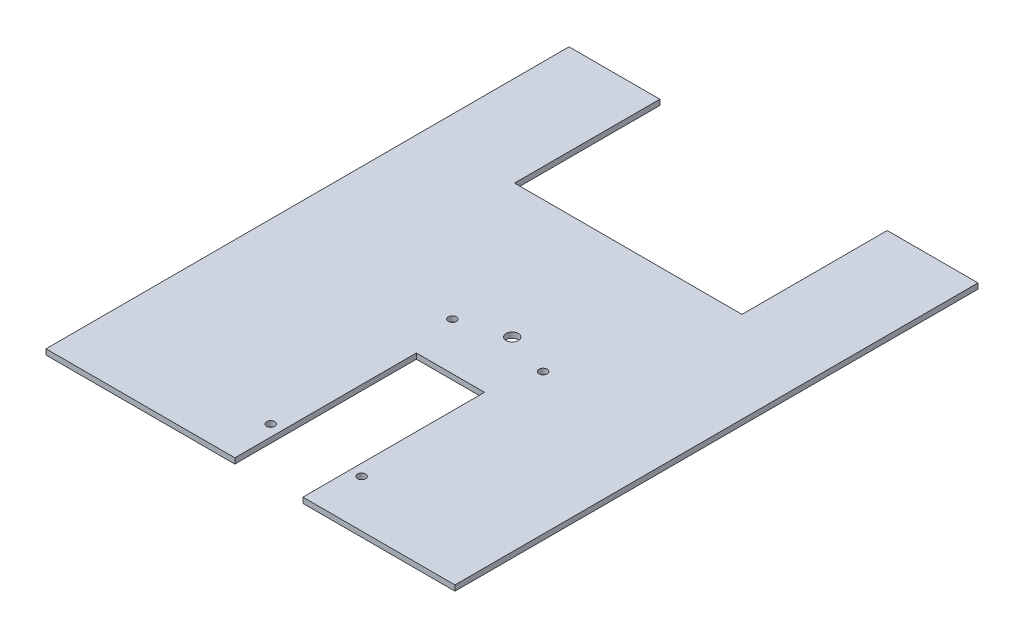
ISO-10303-21;
HEADER;
FILE_DESCRIPTION(('STEP AP214'),'2;1');
FILE_NAME('part.step','',(''),(''),'','','');
FILE_SCHEMA(('AUTOMOTIVE_DESIGN { 1 0 10303 214 1 1 1 1 }'));
ENDSEC;
DATA;
#1=APPLICATION_CONTEXT('core data for automotive mechanical design processes');
#2=APPLICATION_PROTOCOL_DEFINITION('international standard','automotive_design',2000,#1);
#3=PRODUCT_CONTEXT('',#1,'mechanical');
#4=PRODUCT('Part','Part','',(#3));
#5=PRODUCT_RELATED_PRODUCT_CATEGORY('part','',(#4));
#6=PRODUCT_DEFINITION_FORMATION('','',#4);
#7=PRODUCT_DEFINITION_CONTEXT('part definition',#1,'design');
#8=PRODUCT_DEFINITION('design','',#6,#7);
#9=PRODUCT_DEFINITION_SHAPE('','',#8);
#10=(LENGTH_UNIT() NAMED_UNIT(*) SI_UNIT(.MILLI.,.METRE.));
#11=(NAMED_UNIT(*) PLANE_ANGLE_UNIT() SI_UNIT($,.RADIAN.));
#12=(NAMED_UNIT(*) SI_UNIT($,.STERADIAN.) SOLID_ANGLE_UNIT());
#13=UNCERTAINTY_MEASURE_WITH_UNIT(LENGTH_MEASURE(1.E-05),#10,'distance_accuracy_value','');
#14=(GEOMETRIC_REPRESENTATION_CONTEXT(3) GLOBAL_UNCERTAINTY_ASSIGNED_CONTEXT((#13)) GLOBAL_UNIT_ASSIGNED_CONTEXT((#10,
#11,#12)) REPRESENTATION_CONTEXT('',''));
#15=CARTESIAN_POINT('',(0.,0.,0.));
#16=DIRECTION('',(0.,0.,1.));
#17=DIRECTION('',(1.,0.,0.));
#18=AXIS2_PLACEMENT_3D('',#15,#16,#17);
#19=CARTESIAN_POINT('',(-112.62,1.5,144.035));
#20=DIRECTION('',(0.,0.,-1.));
#21=DIRECTION('',(-1.,0.,0.));
#22=AXIS2_PLACEMENT_3D('',#19,#20,#21);
#23=PLANE('',#22);
#24=DIRECTION('',(1.,0.,0.));
#25=VECTOR('',#24,1.);
#26=CARTESIAN_POINT('',(-112.62,1.5,144.035));
#27=LINE('',#26,#25);
#28=CARTESIAN_POINT('',(28.88,1.5,144.035));
#29=VERTEX_POINT('',#28);
#30=CARTESIAN_POINT('',(112.62,1.5,144.035));
#31=VERTEX_POINT('',#30);
#32=EDGE_CURVE('E153',#29,#31,#27,.T.);
#33=ORIENTED_EDGE('',*,*,#32,.F.);
#34=DIRECTION('',(0.,1.,0.));
#35=VECTOR('',#34,1.);
#36=CARTESIAN_POINT('',(28.88,-1.5,144.035));
#37=LINE('',#36,#35);
#38=CARTESIAN_POINT('',(28.88,-1.5,144.035));
#39=VERTEX_POINT('',#38);
#40=EDGE_CURVE('E223',#39,#29,#37,.T.);
#41=ORIENTED_EDGE('',*,*,#40,.F.);
#42=DIRECTION('',(1.,0.,0.));
#43=VECTOR('',#42,1.);
#44=CARTESIAN_POINT('',(-112.62,-1.5,144.035));
#45=LINE('',#44,#43);
#46=CARTESIAN_POINT('',(112.62,-1.5,144.035));
#47=VERTEX_POINT('',#46);
#48=EDGE_CURVE('E174',#39,#47,#45,.T.);
#49=ORIENTED_EDGE('',*,*,#48,.T.);
#50=DIRECTION('',(0.,-1.,0.));
#51=VECTOR('',#50,1.);
#52=CARTESIAN_POINT('',(112.62,1.5,144.035));
#53=LINE('',#52,#51);
#54=EDGE_CURVE('E42',#31,#47,#53,.T.);
#55=ORIENTED_EDGE('',*,*,#54,.F.);
#56=EDGE_LOOP('',(#33,#41,#49,#55));
#57=FACE_BOUND('',#56,.T.);
#58=ADVANCED_FACE('F33',(#57),#23,.F.);
#59=CARTESIAN_POINT('',(-112.62,1.5,-144.035));
#60=DIRECTION('',(0.,0.,1.));
#61=DIRECTION('',(1.,0.,0.));
#62=AXIS2_PLACEMENT_3D('',#59,#60,#61);
#63=PLANE('',#62);
#64=DIRECTION('',(-1.,0.,0.));
#65=VECTOR('',#64,1.);
#66=CARTESIAN_POINT('',(-112.62,-1.5,-144.035));
#67=LINE('',#66,#65);
#68=CARTESIAN_POINT('',(112.62,-1.5,-144.035));
#69=VERTEX_POINT('',#68);
#70=CARTESIAN_POINT('',(62.62,-1.5,-144.035));
#71=VERTEX_POINT('',#70);
#72=EDGE_CURVE('E140',#69,#71,#67,.T.);
#73=ORIENTED_EDGE('',*,*,#72,.T.);
#74=DIRECTION('',(0.,1.,0.));
#75=VECTOR('',#74,1.);
#76=CARTESIAN_POINT('',(62.62,-1.5,-144.035));
#77=LINE('',#76,#75);
#78=CARTESIAN_POINT('',(62.62,1.5,-144.035));
#79=VERTEX_POINT('',#78);
#80=EDGE_CURVE('E123',#71,#79,#77,.T.);
#81=ORIENTED_EDGE('',*,*,#80,.T.);
#82=DIRECTION('',(-1.,0.,0.));
#83=VECTOR('',#82,1.);
#84=CARTESIAN_POINT('',(-112.62,1.5,-144.035));
#85=LINE('',#84,#83);
#86=CARTESIAN_POINT('',(112.62,1.5,-144.035));
#87=VERTEX_POINT('',#86);
#88=EDGE_CURVE('E162',#87,#79,#85,.T.);
#89=ORIENTED_EDGE('',*,*,#88,.F.);
#90=DIRECTION('',(0.,-1.,0.));
#91=VECTOR('',#90,1.);
#92=CARTESIAN_POINT('',(112.62,1.5,-144.035));
#93=LINE('',#92,#91);
#94=EDGE_CURVE('E148',#87,#69,#93,.T.);
#95=ORIENTED_EDGE('',*,*,#94,.T.);
#96=EDGE_LOOP('',(#73,#81,#89,#95));
#97=FACE_BOUND('',#96,.T.);
#98=ADVANCED_FACE('F146',(#97),#63,.F.);
#99=CARTESIAN_POINT('',(-112.62,1.5,144.035));
#100=DIRECTION('',(1.,0.,0.));
#101=DIRECTION('',(0.,0.,-1.));
#102=AXIS2_PLACEMENT_3D('',#99,#100,#101);
#103=PLANE('',#102);
#104=DIRECTION('',(0.,0.,1.));
#105=VECTOR('',#104,1.);
#106=CARTESIAN_POINT('',(-112.62,-1.5,144.035));
#107=LINE('',#106,#105);
#108=CARTESIAN_POINT('',(-112.62,-1.5,-144.035));
#109=VERTEX_POINT('',#108);
#110=CARTESIAN_POINT('',(-112.62,-1.5,144.035));
#111=VERTEX_POINT('',#110);
#112=EDGE_CURVE('E179',#109,#111,#107,.T.);
#113=ORIENTED_EDGE('',*,*,#112,.T.);
#114=DIRECTION('',(0.,-1.,0.));
#115=VECTOR('',#114,1.);
#116=CARTESIAN_POINT('',(-112.62,1.5,144.035));
#117=LINE('',#116,#115);
#118=CARTESIAN_POINT('',(-112.62,1.5,144.035));
#119=VERTEX_POINT('',#118);
#120=EDGE_CURVE('E11',#119,#111,#117,.T.);
#121=ORIENTED_EDGE('',*,*,#120,.F.);
#122=DIRECTION('',(0.,0.,1.));
#123=VECTOR('',#122,1.);
#124=CARTESIAN_POINT('',(-112.62,1.5,144.035));
#125=LINE('',#124,#123);
#126=CARTESIAN_POINT('',(-112.62,1.5,-144.035));
#127=VERTEX_POINT('',#126);
#128=EDGE_CURVE('E149',#127,#119,#125,.T.);
#129=ORIENTED_EDGE('',*,*,#128,.F.);
#130=DIRECTION('',(0.,-1.,0.));
#131=VECTOR('',#130,1.);
#132=CARTESIAN_POINT('',(-112.62,1.5,-144.035));
#133=LINE('',#132,#131);
#134=EDGE_CURVE('E159',#127,#109,#133,.T.);
#135=ORIENTED_EDGE('',*,*,#134,.T.);
#136=EDGE_LOOP('',(#113,#121,#129,#135));
#137=FACE_BOUND('',#136,.T.);
#138=ADVANCED_FACE('F35',(#137),#103,.F.);
#139=CARTESIAN_POINT('',(-8.63,-1.5,144.035));
#140=VERTEX_POINT('',#139);
#141=EDGE_CURVE('E175',#111,#140,#45,.T.);
#142=ORIENTED_EDGE('',*,*,#141,.T.);
#143=DIRECTION('',(0.,1.,0.));
#144=VECTOR('',#143,1.);
#145=CARTESIAN_POINT('',(-8.63,-1.5,144.035));
#146=LINE('',#145,#144);
#147=CARTESIAN_POINT('',(-8.63,1.5,144.035));
#148=VERTEX_POINT('',#147);
#149=EDGE_CURVE('E221',#140,#148,#146,.T.);
#150=ORIENTED_EDGE('',*,*,#149,.T.);
#151=EDGE_CURVE('E187',#119,#148,#27,.T.);
#152=ORIENTED_EDGE('',*,*,#151,.F.);
#153=ORIENTED_EDGE('',*,*,#120,.T.);
#154=EDGE_LOOP('',(#142,#150,#152,#153));
#155=FACE_BOUND('',#154,.T.);
#156=ADVANCED_FACE('F276',(#155),#23,.F.);
#157=CARTESIAN_POINT('',(112.62,1.5,144.035));
#158=DIRECTION('',(-1.,0.,0.));
#159=DIRECTION('',(0.,0.,1.));
#160=AXIS2_PLACEMENT_3D('',#157,#158,#159);
#161=PLANE('',#160);
#162=DIRECTION('',(0.,0.,-1.));
#163=VECTOR('',#162,1.);
#164=CARTESIAN_POINT('',(112.62,-1.5,144.035));
#165=LINE('',#164,#163);
#166=EDGE_CURVE('E155',#47,#69,#165,.T.);
#167=ORIENTED_EDGE('',*,*,#166,.T.);
#168=ORIENTED_EDGE('',*,*,#94,.F.);
#169=DIRECTION('',(0.,0.,-1.));
#170=VECTOR('',#169,1.);
#171=CARTESIAN_POINT('',(112.62,1.5,144.035));
#172=LINE('',#171,#170);
#173=EDGE_CURVE('E169',#31,#87,#172,.T.);
#174=ORIENTED_EDGE('',*,*,#173,.F.);
#175=ORIENTED_EDGE('',*,*,#54,.T.);
#176=EDGE_LOOP('',(#167,#168,#174,#175));
#177=FACE_BOUND('',#176,.T.);
#178=ADVANCED_FACE('F168',(#177),#161,.F.);
#179=CARTESIAN_POINT('',(-62.62,1.5,-144.035));
#180=VERTEX_POINT('',#179);
#181=EDGE_CURVE('E185',#180,#127,#85,.T.);
#182=ORIENTED_EDGE('',*,*,#181,.F.);
#183=DIRECTION('',(0.,1.,0.));
#184=VECTOR('',#183,1.);
#185=CARTESIAN_POINT('',(-62.62,-1.5,-144.035));
#186=LINE('',#185,#184);
#187=CARTESIAN_POINT('',(-62.62,-1.5,-144.035));
#188=VERTEX_POINT('',#187);
#189=EDGE_CURVE('E133',#188,#180,#186,.T.);
#190=ORIENTED_EDGE('',*,*,#189,.F.);
#191=EDGE_CURVE('E150',#188,#109,#67,.T.);
#192=ORIENTED_EDGE('',*,*,#191,.T.);
#193=ORIENTED_EDGE('',*,*,#134,.F.);
#194=EDGE_LOOP('',(#182,#190,#192,#193));
#195=FACE_BOUND('',#194,.T.);
#196=ADVANCED_FACE('F258',(#195),#63,.F.);
#197=CARTESIAN_POINT('',(0.,1.5,0.));
#198=DIRECTION('',(0.,-1.,0.));
#199=DIRECTION('',(0.,0.,-1.));
#200=AXIS2_PLACEMENT_3D('',#197,#198,#199);
#201=PLANE('',#200);
#202=CARTESIAN_POINT('',(10.125,1.5,10.035));
#203=DIRECTION('',(0.,1.,0.));
#204=DIRECTION('',(0.,0.,1.));
#205=AXIS2_PLACEMENT_3D('',#202,#203,#204);
#206=CIRCLE('',#205,3.3782);
#207=CARTESIAN_POINT('',(10.125,1.5,13.4132));
#208=VERTEX_POINT('',#207);
#209=EDGE_CURVE('E213',#208,#208,#206,.T.);
#210=ORIENTED_EDGE('',*,*,#209,.F.);
#211=EDGE_LOOP('',(#210));
#212=FACE_BOUND('',#211,.T.);
#213=CARTESIAN_POINT('',(-14.88,1.5,117.99));
#214=DIRECTION('',(0.,1.,0.));
#215=DIRECTION('',(0.,0.,1.));
#216=AXIS2_PLACEMENT_3D('',#213,#214,#215);
#217=CIRCLE('',#216,2.24999999999999);
#218=CARTESIAN_POINT('',(-14.88,1.5,120.24));
#219=VERTEX_POINT('',#218);
#220=EDGE_CURVE('E210',#219,#219,#217,.T.);
#221=ORIENTED_EDGE('',*,*,#220,.F.);
#222=EDGE_LOOP('',(#221));
#223=FACE_BOUND('',#222,.T.);
#224=CARTESIAN_POINT('',(-14.88,1.5,17.99));
#225=DIRECTION('',(0.,1.,0.));
#226=DIRECTION('',(0.,0.,1.));
#227=AXIS2_PLACEMENT_3D('',#224,#225,#226);
#228=CIRCLE('',#227,2.24999999999999);
#229=CARTESIAN_POINT('',(-14.88,1.5,20.24));
#230=VERTEX_POINT('',#229);
#231=EDGE_CURVE('E204',#230,#230,#228,.T.);
#232=ORIENTED_EDGE('',*,*,#231,.F.);
#233=EDGE_LOOP('',(#232));
#234=FACE_BOUND('',#233,.T.);
#235=CARTESIAN_POINT('',(35.13,1.5,117.99));
#236=DIRECTION('',(0.,1.,0.));
#237=DIRECTION('',(0.,0.,1.));
#238=AXIS2_PLACEMENT_3D('',#235,#236,#237);
#239=CIRCLE('',#238,2.24999999999999);
#240=CARTESIAN_POINT('',(35.13,1.5,120.24));
#241=VERTEX_POINT('',#240);
#242=EDGE_CURVE('E198',#241,#241,#239,.T.);
#243=ORIENTED_EDGE('',*,*,#242,.F.);
#244=EDGE_LOOP('',(#243));
#245=FACE_BOUND('',#244,.T.);
#246=CARTESIAN_POINT('',(35.13,1.5,17.99));
#247=DIRECTION('',(0.,1.,0.));
#248=DIRECTION('',(0.,0.,1.));
#249=AXIS2_PLACEMENT_3D('',#246,#247,#248);
#250=CIRCLE('',#249,2.24999999999999);
#251=CARTESIAN_POINT('',(35.13,1.5,20.24));
#252=VERTEX_POINT('',#251);
#253=EDGE_CURVE('E192',#252,#252,#250,.T.);
#254=ORIENTED_EDGE('',*,*,#253,.F.);
#255=EDGE_LOOP('',(#254));
#256=FACE_BOUND('',#255,.T.);
#257=ORIENTED_EDGE('',*,*,#88,.T.);
#258=DIRECTION('',(0.,0.,-1.));
#259=VECTOR('',#258,1.);
#260=CARTESIAN_POINT('',(62.62,1.5,-144.035));
#261=LINE('',#260,#259);
#262=CARTESIAN_POINT('',(62.62,1.5,-64.035));
#263=VERTEX_POINT('',#262);
#264=EDGE_CURVE('E128',#263,#79,#261,.T.);
#265=ORIENTED_EDGE('',*,*,#264,.F.);
#266=DIRECTION('',(1.,0.,0.));
#267=VECTOR('',#266,1.);
#268=CARTESIAN_POINT('',(62.62,1.5,-64.035));
#269=LINE('',#268,#267);
#270=CARTESIAN_POINT('',(-62.62,1.5,-64.035));
#271=VERTEX_POINT('',#270);
#272=EDGE_CURVE('E143',#271,#263,#269,.T.);
#273=ORIENTED_EDGE('',*,*,#272,.F.);
#274=DIRECTION('',(0.,0.,1.));
#275=VECTOR('',#274,1.);
#276=CARTESIAN_POINT('',(-62.62,1.5,-144.035));
#277=LINE('',#276,#275);
#278=EDGE_CURVE('E245',#180,#271,#277,.T.);
#279=ORIENTED_EDGE('',*,*,#278,.F.);
#280=ORIENTED_EDGE('',*,*,#181,.T.);
#281=ORIENTED_EDGE('',*,*,#128,.T.);
#282=ORIENTED_EDGE('',*,*,#151,.T.);
#283=DIRECTION('',(0.,0.,1.));
#284=VECTOR('',#283,1.);
#285=CARTESIAN_POINT('',(-8.63,1.5,144.035));
#286=LINE('',#285,#284);
#287=CARTESIAN_POINT('',(-8.63,1.5,44.035));
#288=VERTEX_POINT('',#287);
#289=EDGE_CURVE('E225',#288,#148,#286,.T.);
#290=ORIENTED_EDGE('',*,*,#289,.F.);
#291=DIRECTION('',(-1.,0.,0.));
#292=VECTOR('',#291,1.);
#293=CARTESIAN_POINT('',(28.88,1.5,44.035));
#294=LINE('',#293,#292);
#295=CARTESIAN_POINT('',(28.88,1.5,44.035));
#296=VERTEX_POINT('',#295);
#297=EDGE_CURVE('E228',#296,#288,#294,.T.);
#298=ORIENTED_EDGE('',*,*,#297,.F.);
#299=DIRECTION('',(0.,0.,-1.));
#300=VECTOR('',#299,1.);
#301=CARTESIAN_POINT('',(28.88,1.5,144.035));
#302=LINE('',#301,#300);
#303=EDGE_CURVE('E231',#29,#296,#302,.T.);
#304=ORIENTED_EDGE('',*,*,#303,.F.);
#305=ORIENTED_EDGE('',*,*,#32,.T.);
#306=ORIENTED_EDGE('',*,*,#173,.T.);
#307=EDGE_LOOP('',(#257,#265,#273,#279,#280,#281,#282,#290,#298,#304,#305,#306));
#308=FACE_BOUND('',#307,.T.);
#309=ADVANCED_FACE('F262',(#212,#223,#234,#245,#256,#308),#201,.F.);
#310=CARTESIAN_POINT('',(0.,-1.5,0.));
#311=DIRECTION('',(0.,-1.,0.));
#312=DIRECTION('',(0.,0.,-1.));
#313=AXIS2_PLACEMENT_3D('',#310,#311,#312);
#314=PLANE('',#313);
#315=DIRECTION('',(0.,0.,-1.));
#316=VECTOR('',#315,1.);
#317=CARTESIAN_POINT('',(62.62,-1.5,-144.035));
#318=LINE('',#317,#316);
#319=CARTESIAN_POINT('',(62.62,-1.5,-64.035));
#320=VERTEX_POINT('',#319);
#321=EDGE_CURVE('E126',#320,#71,#318,.T.);
#322=ORIENTED_EDGE('',*,*,#321,.T.);
#323=ORIENTED_EDGE('',*,*,#72,.F.);
#324=ORIENTED_EDGE('',*,*,#166,.F.);
#325=ORIENTED_EDGE('',*,*,#48,.F.);
#326=DIRECTION('',(0.,0.,-1.));
#327=VECTOR('',#326,1.);
#328=CARTESIAN_POINT('',(28.88,-1.5,144.035));
#329=LINE('',#328,#327);
#330=CARTESIAN_POINT('',(28.88,-1.5,44.035));
#331=VERTEX_POINT('',#330);
#332=EDGE_CURVE('E227',#39,#331,#329,.T.);
#333=ORIENTED_EDGE('',*,*,#332,.T.);
#334=DIRECTION('',(-1.,0.,0.));
#335=VECTOR('',#334,1.);
#336=CARTESIAN_POINT('',(28.88,-1.5,44.035));
#337=LINE('',#336,#335);
#338=CARTESIAN_POINT('',(-8.63,-1.5,44.035));
#339=VERTEX_POINT('',#338);
#340=EDGE_CURVE('E235',#331,#339,#337,.T.);
#341=ORIENTED_EDGE('',*,*,#340,.T.);
#342=DIRECTION('',(0.,0.,1.));
#343=VECTOR('',#342,1.);
#344=CARTESIAN_POINT('',(-8.63,-1.5,144.035));
#345=LINE('',#344,#343);
#346=EDGE_CURVE('E57',#339,#140,#345,.T.);
#347=ORIENTED_EDGE('',*,*,#346,.T.);
#348=ORIENTED_EDGE('',*,*,#141,.F.);
#349=ORIENTED_EDGE('',*,*,#112,.F.);
#350=ORIENTED_EDGE('',*,*,#191,.F.);
#351=DIRECTION('',(0.,0.,1.));
#352=VECTOR('',#351,1.);
#353=CARTESIAN_POINT('',(-62.62,-1.5,-144.035));
#354=LINE('',#353,#352);
#355=CARTESIAN_POINT('',(-62.62,-1.5,-64.035));
#356=VERTEX_POINT('',#355);
#357=EDGE_CURVE('E142',#188,#356,#354,.T.);
#358=ORIENTED_EDGE('',*,*,#357,.T.);
#359=DIRECTION('',(1.,0.,0.));
#360=VECTOR('',#359,1.);
#361=CARTESIAN_POINT('',(62.62,-1.5,-64.035));
#362=LINE('',#361,#360);
#363=EDGE_CURVE('E49',#356,#320,#362,.T.);
#364=ORIENTED_EDGE('',*,*,#363,.T.);
#365=EDGE_LOOP('',(#322,#323,#324,#325,#333,#341,#347,#348,#349,#350,#358,#364));
#366=FACE_BOUND('',#365,.T.);
#367=CARTESIAN_POINT('',(10.125,-1.5,10.035));
#368=DIRECTION('',(0.,-1.,0.));
#369=DIRECTION('',(0.,0.,-1.));
#370=AXIS2_PLACEMENT_3D('',#367,#368,#369);
#371=CIRCLE('',#370,3.3782);
#372=CARTESIAN_POINT('',(10.125,-1.5,6.65679999999999));
#373=VERTEX_POINT('',#372);
#374=EDGE_CURVE('E37',#373,#373,#371,.T.);
#375=ORIENTED_EDGE('',*,*,#374,.F.);
#376=EDGE_LOOP('',(#375));
#377=FACE_BOUND('',#376,.T.);
#378=CARTESIAN_POINT('',(-14.88,-1.5,117.99));
#379=DIRECTION('',(0.,-1.,0.));
#380=DIRECTION('',(0.,0.,-1.));
#381=AXIS2_PLACEMENT_3D('',#378,#379,#380);
#382=CIRCLE('',#381,2.24999999999999);
#383=CARTESIAN_POINT('',(-14.88,-1.5,115.74));
#384=VERTEX_POINT('',#383);
#385=EDGE_CURVE('E207',#384,#384,#382,.T.);
#386=ORIENTED_EDGE('',*,*,#385,.F.);
#387=EDGE_LOOP('',(#386));
#388=FACE_BOUND('',#387,.T.);
#389=CARTESIAN_POINT('',(-14.88,-1.5,17.99));
#390=DIRECTION('',(0.,-1.,0.));
#391=DIRECTION('',(0.,0.,-1.));
#392=AXIS2_PLACEMENT_3D('',#389,#390,#391);
#393=CIRCLE('',#392,2.24999999999999);
#394=CARTESIAN_POINT('',(-14.88,-1.5,15.74));
#395=VERTEX_POINT('',#394);
#396=EDGE_CURVE('E201',#395,#395,#393,.T.);
#397=ORIENTED_EDGE('',*,*,#396,.F.);
#398=EDGE_LOOP('',(#397));
#399=FACE_BOUND('',#398,.T.);
#400=CARTESIAN_POINT('',(35.13,-1.5,117.99));
#401=DIRECTION('',(0.,-1.,0.));
#402=DIRECTION('',(0.,0.,-1.));
#403=AXIS2_PLACEMENT_3D('',#400,#401,#402);
#404=CIRCLE('',#403,2.25);
#405=CARTESIAN_POINT('',(35.13,-1.5,115.74));
#406=VERTEX_POINT('',#405);
#407=EDGE_CURVE('E195',#406,#406,#404,.T.);
#408=ORIENTED_EDGE('',*,*,#407,.F.);
#409=EDGE_LOOP('',(#408));
#410=FACE_BOUND('',#409,.T.);
#411=CARTESIAN_POINT('',(35.13,-1.5,17.99));
#412=DIRECTION('',(0.,-1.,0.));
#413=DIRECTION('',(0.,0.,-1.));
#414=AXIS2_PLACEMENT_3D('',#411,#412,#413);
#415=CIRCLE('',#414,2.25);
#416=CARTESIAN_POINT('',(35.13,-1.5,15.74));
#417=VERTEX_POINT('',#416);
#418=EDGE_CURVE('E183',#417,#417,#415,.T.);
#419=ORIENTED_EDGE('',*,*,#418,.F.);
#420=EDGE_LOOP('',(#419));
#421=FACE_BOUND('',#420,.T.);
#422=ADVANCED_FACE('F137',(#366,#377,#388,#399,#410,#421),#314,.T.);
#423=CARTESIAN_POINT('',(35.13,1.5,17.99));
#424=DIRECTION('',(0.,1.,0.));
#425=DIRECTION('',(0.,0.,1.));
#426=AXIS2_PLACEMENT_3D('',#423,#424,#425);
#427=CYLINDRICAL_SURFACE('',#426,2.25);
#428=ORIENTED_EDGE('',*,*,#253,.T.);
#429=EDGE_LOOP('',(#428));
#430=FACE_BOUND('',#429,.T.);
#431=ORIENTED_EDGE('',*,*,#418,.T.);
#432=EDGE_LOOP('',(#431));
#433=FACE_BOUND('',#432,.T.);
#434=ADVANCED_FACE('F322',(#430,#433),#427,.F.);
#435=CARTESIAN_POINT('',(35.13,1.5,117.99));
#436=DIRECTION('',(0.,1.,0.));
#437=DIRECTION('',(0.,0.,1.));
#438=AXIS2_PLACEMENT_3D('',#435,#436,#437);
#439=CYLINDRICAL_SURFACE('',#438,2.25);
#440=ORIENTED_EDGE('',*,*,#242,.T.);
#441=EDGE_LOOP('',(#440));
#442=FACE_BOUND('',#441,.T.);
#443=ORIENTED_EDGE('',*,*,#407,.T.);
#444=EDGE_LOOP('',(#443));
#445=FACE_BOUND('',#444,.T.);
#446=ADVANCED_FACE('F318',(#442,#445),#439,.F.);
#447=CARTESIAN_POINT('',(-14.88,1.5,17.99));
#448=DIRECTION('',(0.,1.,0.));
#449=DIRECTION('',(0.,0.,1.));
#450=AXIS2_PLACEMENT_3D('',#447,#448,#449);
#451=CYLINDRICAL_SURFACE('',#450,2.24999999999999);
#452=ORIENTED_EDGE('',*,*,#231,.T.);
#453=EDGE_LOOP('',(#452));
#454=FACE_BOUND('',#453,.T.);
#455=ORIENTED_EDGE('',*,*,#396,.T.);
#456=EDGE_LOOP('',(#455));
#457=FACE_BOUND('',#456,.T.);
#458=ADVANCED_FACE('F314',(#454,#457),#451,.F.);
#459=CARTESIAN_POINT('',(-14.88,1.5,117.99));
#460=DIRECTION('',(0.,1.,0.));
#461=DIRECTION('',(0.,0.,1.));
#462=AXIS2_PLACEMENT_3D('',#459,#460,#461);
#463=CYLINDRICAL_SURFACE('',#462,2.24999999999999);
#464=ORIENTED_EDGE('',*,*,#220,.T.);
#465=EDGE_LOOP('',(#464));
#466=FACE_BOUND('',#465,.T.);
#467=ORIENTED_EDGE('',*,*,#385,.T.);
#468=EDGE_LOOP('',(#467));
#469=FACE_BOUND('',#468,.T.);
#470=ADVANCED_FACE('F307',(#466,#469),#463,.F.);
#471=CARTESIAN_POINT('',(10.125,1.5,10.035));
#472=DIRECTION('',(0.,1.,0.));
#473=DIRECTION('',(0.,0.,1.));
#474=AXIS2_PLACEMENT_3D('',#471,#472,#473);
#475=CYLINDRICAL_SURFACE('',#474,3.3782);
#476=ORIENTED_EDGE('',*,*,#374,.T.);
#477=EDGE_LOOP('',(#476));
#478=FACE_BOUND('',#477,.T.);
#479=ORIENTED_EDGE('',*,*,#209,.T.);
#480=EDGE_LOOP('',(#479));
#481=FACE_BOUND('',#480,.T.);
#482=ADVANCED_FACE('F300',(#478,#481),#475,.F.);
#483=CARTESIAN_POINT('',(28.88,-1.5,144.035));
#484=DIRECTION('',(1.,0.,0.));
#485=DIRECTION('',(0.,0.,-1.));
#486=AXIS2_PLACEMENT_3D('',#483,#484,#485);
#487=PLANE('',#486);
#488=ORIENTED_EDGE('',*,*,#303,.T.);
#489=DIRECTION('',(0.,1.,0.));
#490=VECTOR('',#489,1.);
#491=CARTESIAN_POINT('',(28.88,-1.5,44.035));
#492=LINE('',#491,#490);
#493=EDGE_CURVE('E217',#331,#296,#492,.T.);
#494=ORIENTED_EDGE('',*,*,#493,.F.);
#495=ORIENTED_EDGE('',*,*,#332,.F.);
#496=ORIENTED_EDGE('',*,*,#40,.T.);
#497=EDGE_LOOP('',(#488,#494,#495,#496));
#498=FACE_BOUND('',#497,.T.);
#499=ADVANCED_FACE('F297',(#498),#487,.F.);
#500=CARTESIAN_POINT('',(-8.63,-1.5,144.035));
#501=DIRECTION('',(-1.,0.,0.));
#502=DIRECTION('',(0.,0.,1.));
#503=AXIS2_PLACEMENT_3D('',#500,#501,#502);
#504=PLANE('',#503);
#505=ORIENTED_EDGE('',*,*,#289,.T.);
#506=ORIENTED_EDGE('',*,*,#149,.F.);
#507=ORIENTED_EDGE('',*,*,#346,.F.);
#508=DIRECTION('',(0.,1.,0.));
#509=VECTOR('',#508,1.);
#510=CARTESIAN_POINT('',(-8.63,-1.5,44.035));
#511=LINE('',#510,#509);
#512=EDGE_CURVE('E219',#339,#288,#511,.T.);
#513=ORIENTED_EDGE('',*,*,#512,.T.);
#514=EDGE_LOOP('',(#505,#506,#507,#513));
#515=FACE_BOUND('',#514,.T.);
#516=ADVANCED_FACE('F293',(#515),#504,.F.);
#517=CARTESIAN_POINT('',(28.88,-1.5,44.035));
#518=DIRECTION('',(0.,0.,-1.));
#519=DIRECTION('',(-1.,0.,0.));
#520=AXIS2_PLACEMENT_3D('',#517,#518,#519);
#521=PLANE('',#520);
#522=ORIENTED_EDGE('',*,*,#297,.T.);
#523=ORIENTED_EDGE('',*,*,#512,.F.);
#524=ORIENTED_EDGE('',*,*,#340,.F.);
#525=ORIENTED_EDGE('',*,*,#493,.T.);
#526=EDGE_LOOP('',(#522,#523,#524,#525));
#527=FACE_BOUND('',#526,.T.);
#528=ADVANCED_FACE('F273',(#527),#521,.F.);
#529=CARTESIAN_POINT('',(62.62,-1.5,-144.035));
#530=DIRECTION('',(1.,0.,0.));
#531=DIRECTION('',(0.,0.,-1.));
#532=AXIS2_PLACEMENT_3D('',#529,#530,#531);
#533=PLANE('',#532);
#534=ORIENTED_EDGE('',*,*,#264,.T.);
#535=ORIENTED_EDGE('',*,*,#80,.F.);
#536=ORIENTED_EDGE('',*,*,#321,.F.);
#537=DIRECTION('',(0.,1.,0.));
#538=VECTOR('',#537,1.);
#539=CARTESIAN_POINT('',(62.62,-1.5,-64.035));
#540=LINE('',#539,#538);
#541=EDGE_CURVE('E216',#320,#263,#540,.T.);
#542=ORIENTED_EDGE('',*,*,#541,.T.);
#543=EDGE_LOOP('',(#534,#535,#536,#542));
#544=FACE_BOUND('',#543,.T.);
#545=ADVANCED_FACE('F125',(#544),#533,.F.);
#546=CARTESIAN_POINT('',(62.62,-1.5,-64.035));
#547=DIRECTION('',(0.,0.,1.));
#548=DIRECTION('',(1.,0.,0.));
#549=AXIS2_PLACEMENT_3D('',#546,#547,#548);
#550=PLANE('',#549);
#551=ORIENTED_EDGE('',*,*,#272,.T.);
#552=ORIENTED_EDGE('',*,*,#541,.F.);
#553=ORIENTED_EDGE('',*,*,#363,.F.);
#554=DIRECTION('',(0.,1.,0.));
#555=VECTOR('',#554,1.);
#556=CARTESIAN_POINT('',(-62.62,-1.5,-64.035));
#557=LINE('',#556,#555);
#558=EDGE_CURVE('E240',#356,#271,#557,.T.);
#559=ORIENTED_EDGE('',*,*,#558,.T.);
#560=EDGE_LOOP('',(#551,#552,#553,#559));
#561=FACE_BOUND('',#560,.T.);
#562=ADVANCED_FACE('F265',(#561),#550,.F.);
#563=CARTESIAN_POINT('',(-62.62,-1.5,-144.035));
#564=DIRECTION('',(-1.,0.,0.));
#565=DIRECTION('',(0.,0.,1.));
#566=AXIS2_PLACEMENT_3D('',#563,#564,#565);
#567=PLANE('',#566);
#568=ORIENTED_EDGE('',*,*,#278,.T.);
#569=ORIENTED_EDGE('',*,*,#558,.F.);
#570=ORIENTED_EDGE('',*,*,#357,.F.);
#571=ORIENTED_EDGE('',*,*,#189,.T.);
#572=EDGE_LOOP('',(#568,#569,#570,#571));
#573=FACE_BOUND('',#572,.T.);
#574=ADVANCED_FACE('F254',(#573),#567,.F.);
#575=CLOSED_SHELL('',(#58,#98,#138,#156,#178,#196,#309,#422,#434,#446,#458,#470,#482,#499,#516,
#528,#545,#562,#574));
#576=MANIFOLD_SOLID_BREP('B2',#575);
#577=ADVANCED_BREP_SHAPE_REPRESENTATION('',(#18,#576),#14);
#578=SHAPE_DEFINITION_REPRESENTATION(#9,#577);
ENDSEC;
END-ISO-10303-21;
